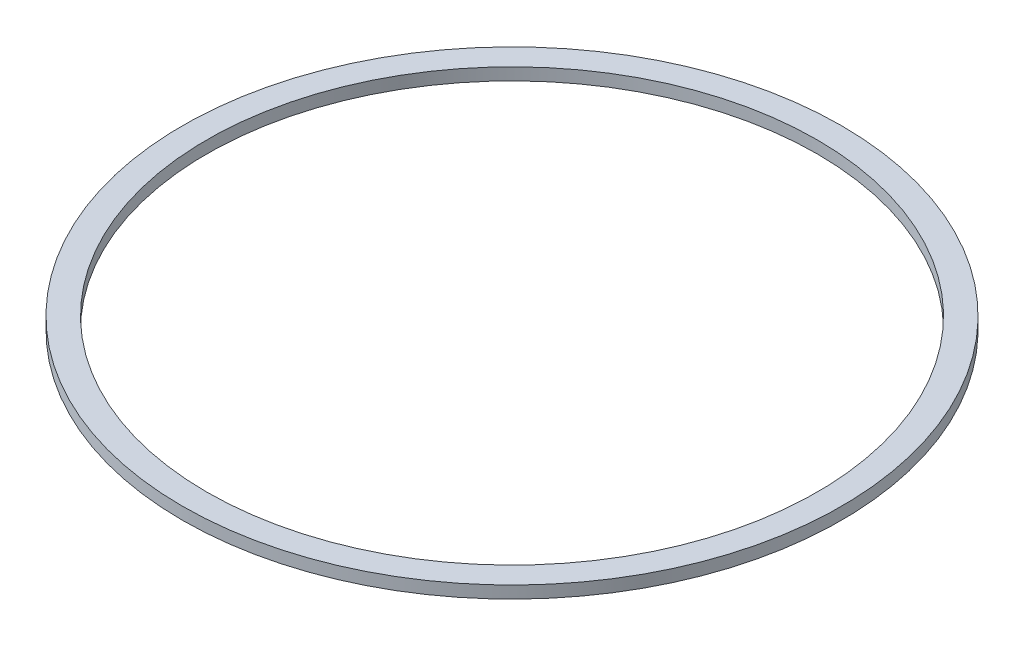
ISO-10303-21;
HEADER;
FILE_DESCRIPTION(('STEP AP214'),'2;1');
FILE_NAME('part.step','',(''),(''),'','','');
FILE_SCHEMA(('AUTOMOTIVE_DESIGN { 1 0 10303 214 1 1 1 1 }'));
ENDSEC;
DATA;
#1=APPLICATION_CONTEXT('core data for automotive mechanical design processes');
#2=APPLICATION_PROTOCOL_DEFINITION('international standard','automotive_design',2000,#1);
#3=PRODUCT_CONTEXT('',#1,'mechanical');
#4=PRODUCT('Part','Part','',(#3));
#5=PRODUCT_RELATED_PRODUCT_CATEGORY('part','',(#4));
#6=PRODUCT_DEFINITION_FORMATION('','',#4);
#7=PRODUCT_DEFINITION_CONTEXT('part definition',#1,'design');
#8=PRODUCT_DEFINITION('design','',#6,#7);
#9=PRODUCT_DEFINITION_SHAPE('','',#8);
#10=(LENGTH_UNIT() NAMED_UNIT(*) SI_UNIT(.MILLI.,.METRE.));
#11=(NAMED_UNIT(*) PLANE_ANGLE_UNIT() SI_UNIT($,.RADIAN.));
#12=(NAMED_UNIT(*) SI_UNIT($,.STERADIAN.) SOLID_ANGLE_UNIT());
#13=UNCERTAINTY_MEASURE_WITH_UNIT(LENGTH_MEASURE(1.E-05),#10,'distance_accuracy_value','');
#14=(GEOMETRIC_REPRESENTATION_CONTEXT(3) GLOBAL_UNCERTAINTY_ASSIGNED_CONTEXT((#13)) GLOBAL_UNIT_ASSIGNED_CONTEXT((#10,
#11,#12)) REPRESENTATION_CONTEXT('',''));
#15=CARTESIAN_POINT('',(0.,0.,0.));
#16=DIRECTION('',(0.,0.,1.));
#17=DIRECTION('',(1.,0.,0.));
#18=AXIS2_PLACEMENT_3D('',#15,#16,#17);
#19=CARTESIAN_POINT('',(0.,1.,0.));
#20=DIRECTION('',(0.,1.,0.));
#21=DIRECTION('',(0.,0.,1.));
#22=AXIS2_PLACEMENT_3D('',#19,#20,#21);
#23=PLANE('',#22);
#24=CARTESIAN_POINT('',(0.,1.,0.));
#25=DIRECTION('',(0.,1.,0.));
#26=DIRECTION('',(0.,0.,1.));
#27=AXIS2_PLACEMENT_3D('',#24,#25,#26);
#28=CIRCLE('',#27,27.);
#29=CARTESIAN_POINT('',(0.,1.,27.));
#30=VERTEX_POINT('',#29);
#31=EDGE_CURVE('E10',#30,#30,#28,.T.);
#32=ORIENTED_EDGE('',*,*,#31,.T.);
#33=EDGE_LOOP('',(#32));
#34=FACE_BOUND('',#33,.T.);
#35=CARTESIAN_POINT('',(0.,1.,0.));
#36=DIRECTION('',(0.,1.,0.));
#37=DIRECTION('',(0.,0.,1.));
#38=AXIS2_PLACEMENT_3D('',#35,#36,#37);
#39=CIRCLE('',#38,25.);
#40=CARTESIAN_POINT('',(0.,1.,25.));
#41=VERTEX_POINT('',#40);
#42=EDGE_CURVE('E39',#41,#41,#39,.T.);
#43=ORIENTED_EDGE('',*,*,#42,.F.);
#44=EDGE_LOOP('',(#43));
#45=FACE_BOUND('',#44,.T.);
#46=ADVANCED_FACE('F28',(#34,#45),#23,.T.);
#47=CARTESIAN_POINT('',(0.,0.,0.));
#48=DIRECTION('',(0.,1.,0.));
#49=DIRECTION('',(0.,0.,1.));
#50=AXIS2_PLACEMENT_3D('',#47,#48,#49);
#51=PLANE('',#50);
#52=CARTESIAN_POINT('',(0.,0.,0.));
#53=DIRECTION('',(0.,1.,0.));
#54=DIRECTION('',(0.,0.,1.));
#55=AXIS2_PLACEMENT_3D('',#52,#53,#54);
#56=CIRCLE('',#55,27.);
#57=CARTESIAN_POINT('',(0.,0.,27.));
#58=VERTEX_POINT('',#57);
#59=EDGE_CURVE('E32',#58,#58,#56,.T.);
#60=ORIENTED_EDGE('',*,*,#59,.F.);
#61=EDGE_LOOP('',(#60));
#62=FACE_BOUND('',#61,.T.);
#63=CARTESIAN_POINT('',(0.,0.,0.));
#64=DIRECTION('',(0.,1.,0.));
#65=DIRECTION('',(0.,0.,1.));
#66=AXIS2_PLACEMENT_3D('',#63,#64,#65);
#67=CIRCLE('',#66,25.);
#68=CARTESIAN_POINT('',(0.,0.,25.));
#69=VERTEX_POINT('',#68);
#70=EDGE_CURVE('E41',#69,#69,#67,.T.);
#71=ORIENTED_EDGE('',*,*,#70,.T.);
#72=EDGE_LOOP('',(#71));
#73=FACE_BOUND('',#72,.T.);
#74=ADVANCED_FACE('F51',(#62,#73),#51,.F.);
#75=CARTESIAN_POINT('',(0.,1.,0.));
#76=DIRECTION('',(0.,-1.,0.));
#77=DIRECTION('',(0.,0.,-1.));
#78=AXIS2_PLACEMENT_3D('',#75,#76,#77);
#79=CYLINDRICAL_SURFACE('',#78,27.);
#80=ORIENTED_EDGE('',*,*,#31,.F.);
#81=EDGE_LOOP('',(#80));
#82=FACE_BOUND('',#81,.T.);
#83=ORIENTED_EDGE('',*,*,#59,.T.);
#84=EDGE_LOOP('',(#83));
#85=FACE_BOUND('',#84,.T.);
#86=ADVANCED_FACE('F30',(#82,#85),#79,.T.);
#87=CARTESIAN_POINT('',(0.,1.,0.));
#88=DIRECTION('',(0.,-1.,0.));
#89=DIRECTION('',(0.,0.,-1.));
#90=AXIS2_PLACEMENT_3D('',#87,#88,#89);
#91=CYLINDRICAL_SURFACE('',#90,25.);
#92=ORIENTED_EDGE('',*,*,#42,.T.);
#93=EDGE_LOOP('',(#92));
#94=FACE_BOUND('',#93,.T.);
#95=ORIENTED_EDGE('',*,*,#70,.F.);
#96=EDGE_LOOP('',(#95));
#97=FACE_BOUND('',#96,.T.);
#98=ADVANCED_FACE('F47',(#94,#97),#91,.F.);
#99=CLOSED_SHELL('',(#46,#74,#86,#98));
#100=MANIFOLD_SOLID_BREP('B2',#99);
#101=ADVANCED_BREP_SHAPE_REPRESENTATION('',(#18,#100),#14);
#102=SHAPE_DEFINITION_REPRESENTATION(#9,#101);
ENDSEC;
END-ISO-10303-21;
